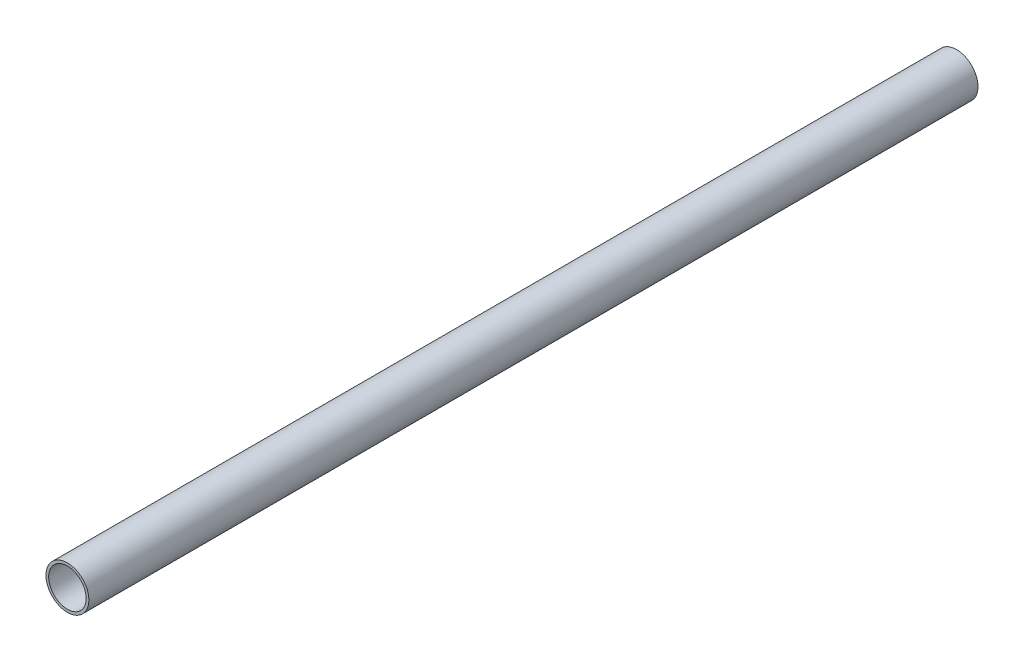
ISO-10303-21;
HEADER;
FILE_DESCRIPTION(('STEP AP214'),'2;1');
FILE_NAME('part.step','',(''),(''),'','','');
FILE_SCHEMA(('AUTOMOTIVE_DESIGN { 1 0 10303 214 1 1 1 1 }'));
ENDSEC;
DATA;
#1=APPLICATION_CONTEXT('core data for automotive mechanical design processes');
#2=APPLICATION_PROTOCOL_DEFINITION('international standard','automotive_design',2000,#1);
#3=PRODUCT_CONTEXT('',#1,'mechanical');
#4=PRODUCT('Part','Part','',(#3));
#5=PRODUCT_RELATED_PRODUCT_CATEGORY('part','',(#4));
#6=PRODUCT_DEFINITION_FORMATION('','',#4);
#7=PRODUCT_DEFINITION_CONTEXT('part definition',#1,'design');
#8=PRODUCT_DEFINITION('design','',#6,#7);
#9=PRODUCT_DEFINITION_SHAPE('','',#8);
#10=(LENGTH_UNIT() NAMED_UNIT(*) SI_UNIT(.MILLI.,.METRE.));
#11=(NAMED_UNIT(*) PLANE_ANGLE_UNIT() SI_UNIT($,.RADIAN.));
#12=(NAMED_UNIT(*) SI_UNIT($,.STERADIAN.) SOLID_ANGLE_UNIT());
#13=UNCERTAINTY_MEASURE_WITH_UNIT(LENGTH_MEASURE(1.E-05),#10,'distance_accuracy_value','');
#14=(GEOMETRIC_REPRESENTATION_CONTEXT(3) GLOBAL_UNCERTAINTY_ASSIGNED_CONTEXT((#13)) GLOBAL_UNIT_ASSIGNED_CONTEXT((#10,
#11,#12)) REPRESENTATION_CONTEXT('',''));
#15=CARTESIAN_POINT('',(0.,0.,0.));
#16=DIRECTION('',(0.,0.,1.));
#17=DIRECTION('',(1.,0.,0.));
#18=AXIS2_PLACEMENT_3D('',#15,#16,#17);
#19=CARTESIAN_POINT('',(2449.7201128805,-5187.00741573402,1000.));
#20=DIRECTION('',(0.,0.,1.));
#21=DIRECTION('',(1.,0.,0.));
#22=AXIS2_PLACEMENT_3D('',#19,#20,#21);
#23=PLANE('',#22);
#24=CARTESIAN_POINT('',(2449.7201128805,-5187.00741573402,1000.));
#25=DIRECTION('',(0.,0.,1.));
#26=DIRECTION('',(1.,0.,0.));
#27=AXIS2_PLACEMENT_3D('',#24,#25,#26);
#28=CIRCLE('',#27,24.125);
#29=CARTESIAN_POINT('',(2473.8451128805,-5187.00741573402,1000.));
#30=VERTEX_POINT('',#29);
#31=EDGE_CURVE('E10',#30,#30,#28,.T.);
#32=ORIENTED_EDGE('',*,*,#31,.T.);
#33=EDGE_LOOP('',(#32));
#34=FACE_BOUND('',#33,.T.);
#35=CARTESIAN_POINT('',(2449.7201128805,-5187.00741573402,1000.));
#36=DIRECTION('',(0.,0.,1.));
#37=DIRECTION('',(1.,0.,0.));
#38=AXIS2_PLACEMENT_3D('',#35,#36,#37);
#39=CIRCLE('',#38,21.0750000000002);
#40=CARTESIAN_POINT('',(2470.7951128805,-5187.00741573402,1000.));
#41=VERTEX_POINT('',#40);
#42=EDGE_CURVE('E43',#41,#41,#39,.T.);
#43=ORIENTED_EDGE('',*,*,#42,.F.);
#44=EDGE_LOOP('',(#43));
#45=FACE_BOUND('',#44,.T.);
#46=ADVANCED_FACE('F32',(#34,#45),#23,.T.);
#47=CARTESIAN_POINT('',(2449.7201128805,-5187.00741573402,0.));
#48=DIRECTION('',(0.,0.,1.));
#49=DIRECTION('',(1.,0.,0.));
#50=AXIS2_PLACEMENT_3D('',#47,#48,#49);
#51=PLANE('',#50);
#52=CARTESIAN_POINT('',(2449.7201128805,-5187.00741573402,0.));
#53=DIRECTION('',(0.,0.,1.));
#54=DIRECTION('',(1.,0.,0.));
#55=AXIS2_PLACEMENT_3D('',#52,#53,#54);
#56=CIRCLE('',#55,24.125);
#57=CARTESIAN_POINT('',(2473.8451128805,-5187.00741573402,0.));
#58=VERTEX_POINT('',#57);
#59=EDGE_CURVE('E36',#58,#58,#56,.T.);
#60=ORIENTED_EDGE('',*,*,#59,.F.);
#61=EDGE_LOOP('',(#60));
#62=FACE_BOUND('',#61,.T.);
#63=CARTESIAN_POINT('',(2449.7201128805,-5187.00741573402,0.));
#64=DIRECTION('',(0.,0.,1.));
#65=DIRECTION('',(1.,0.,0.));
#66=AXIS2_PLACEMENT_3D('',#63,#64,#65);
#67=CIRCLE('',#66,21.0750000000002);
#68=CARTESIAN_POINT('',(2470.7951128805,-5187.00741573402,0.));
#69=VERTEX_POINT('',#68);
#70=EDGE_CURVE('E45',#69,#69,#67,.T.);
#71=ORIENTED_EDGE('',*,*,#70,.T.);
#72=EDGE_LOOP('',(#71));
#73=FACE_BOUND('',#72,.T.);
#74=ADVANCED_FACE('F55',(#62,#73),#51,.F.);
#75=CARTESIAN_POINT('',(2449.7201128805,-5187.00741573402,1000.));
#76=DIRECTION('',(0.,0.,-1.));
#77=DIRECTION('',(-1.,0.,0.));
#78=AXIS2_PLACEMENT_3D('',#75,#76,#77);
#79=CYLINDRICAL_SURFACE('',#78,24.125);
#80=ORIENTED_EDGE('',*,*,#31,.F.);
#81=EDGE_LOOP('',(#80));
#82=FACE_BOUND('',#81,.T.);
#83=ORIENTED_EDGE('',*,*,#59,.T.);
#84=EDGE_LOOP('',(#83));
#85=FACE_BOUND('',#84,.T.);
#86=ADVANCED_FACE('F34',(#82,#85),#79,.T.);
#87=CARTESIAN_POINT('',(2449.7201128805,-5187.00741573402,1000.));
#88=DIRECTION('',(0.,0.,-1.));
#89=DIRECTION('',(-1.,0.,0.));
#90=AXIS2_PLACEMENT_3D('',#87,#88,#89);
#91=CYLINDRICAL_SURFACE('',#90,21.0750000000002);
#92=ORIENTED_EDGE('',*,*,#42,.T.);
#93=EDGE_LOOP('',(#92));
#94=FACE_BOUND('',#93,.T.);
#95=ORIENTED_EDGE('',*,*,#70,.F.);
#96=EDGE_LOOP('',(#95));
#97=FACE_BOUND('',#96,.T.);
#98=ADVANCED_FACE('F51',(#94,#97),#91,.F.);
#99=CLOSED_SHELL('',(#46,#74,#86,#98));
#100=MANIFOLD_SOLID_BREP('B2',#99);
#101=ADVANCED_BREP_SHAPE_REPRESENTATION('',(#18,#100),#14);
#102=SHAPE_DEFINITION_REPRESENTATION(#9,#101);
ENDSEC;
END-ISO-10303-21;
